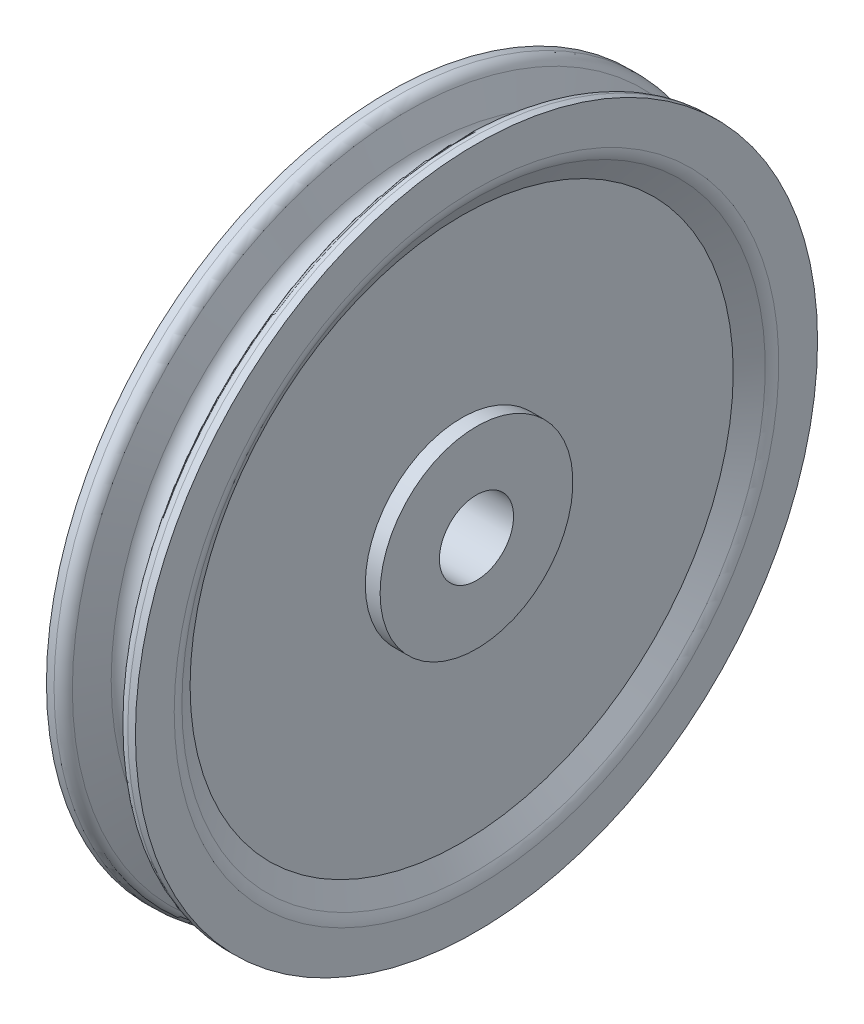
ISO-10303-21;
HEADER;
FILE_DESCRIPTION(('STEP AP214'),'2;1');
FILE_NAME('part.step','',(''),(''),'','','');
FILE_SCHEMA(('AUTOMOTIVE_DESIGN { 1 0 10303 214 1 1 1 1 }'));
ENDSEC;
DATA;
#1=APPLICATION_CONTEXT('core data for automotive mechanical design processes');
#2=APPLICATION_PROTOCOL_DEFINITION('international standard','automotive_design',2000,#1);
#3=PRODUCT_CONTEXT('',#1,'mechanical');
#4=PRODUCT('Part','Part','',(#3));
#5=PRODUCT_RELATED_PRODUCT_CATEGORY('part','',(#4));
#6=PRODUCT_DEFINITION_FORMATION('','',#4);
#7=PRODUCT_DEFINITION_CONTEXT('part definition',#1,'design');
#8=PRODUCT_DEFINITION('design','',#6,#7);
#9=PRODUCT_DEFINITION_SHAPE('','',#8);
#10=(LENGTH_UNIT() NAMED_UNIT(*) SI_UNIT(.MILLI.,.METRE.));
#11=(NAMED_UNIT(*) PLANE_ANGLE_UNIT() SI_UNIT($,.RADIAN.));
#12=(NAMED_UNIT(*) SI_UNIT($,.STERADIAN.) SOLID_ANGLE_UNIT());
#13=UNCERTAINTY_MEASURE_WITH_UNIT(LENGTH_MEASURE(1.E-05),#10,'distance_accuracy_value','');
#14=(GEOMETRIC_REPRESENTATION_CONTEXT(3) GLOBAL_UNCERTAINTY_ASSIGNED_CONTEXT((#13)) GLOBAL_UNIT_ASSIGNED_CONTEXT((#10,
#11,#12)) REPRESENTATION_CONTEXT('',''));
#15=CARTESIAN_POINT('',(0.,0.,0.));
#16=DIRECTION('',(0.,0.,1.));
#17=DIRECTION('',(1.,0.,0.));
#18=AXIS2_PLACEMENT_3D('',#15,#16,#17);
#19=CARTESIAN_POINT('',(8.,0.,0.));
#20=DIRECTION('',(-1.,0.,0.));
#21=DIRECTION('',(0.,0.,1.));
#22=AXIS2_PLACEMENT_3D('',#19,#20,#21);
#23=TOROIDAL_SURFACE('',#22,101.919552915921,7.);
#24=CARTESIAN_POINT('',(14.0208621513478,0.,0.));
#25=DIRECTION('',(-1.,0.,0.));
#26=DIRECTION('',(0.,0.,1.));
#27=AXIS2_PLACEMENT_3D('',#24,#25,#26);
#28=CIRCLE('',#27,98.3489480715747);
#29=CARTESIAN_POINT('',(14.0208621513478,0.,98.3489480715747));
#30=VERTEX_POINT('',#29);
#31=EDGE_CURVE('E96',#30,#30,#28,.T.);
#32=ORIENTED_EDGE('',*,*,#31,.T.);
#33=EDGE_LOOP('',(#32));
#34=FACE_BOUND('',#33,.T.);
#35=CARTESIAN_POINT('',(15.,0.,0.));
#36=DIRECTION('',(-1.,0.,0.));
#37=DIRECTION('',(0.,0.,1.));
#38=AXIS2_PLACEMENT_3D('',#35,#36,#37);
#39=CIRCLE('',#38,101.919552915921);
#40=CARTESIAN_POINT('',(15.,0.,101.919552915921));
#41=VERTEX_POINT('',#40);
#42=EDGE_CURVE('E10',#41,#41,#39,.T.);
#43=ORIENTED_EDGE('',*,*,#42,.F.);
#44=EDGE_LOOP('',(#43));
#45=FACE_BOUND('',#44,.T.);
#46=ADVANCED_FACE('F32',(#34,#45),#23,.T.);
#47=CARTESIAN_POINT('',(15.,0.,0.));
#48=DIRECTION('',(1.,0.,0.));
#49=DIRECTION('',(0.,0.,-1.));
#50=AXIS2_PLACEMENT_3D('',#47,#48,#49);
#51=PLANE('',#50);
#52=ORIENTED_EDGE('',*,*,#42,.T.);
#53=EDGE_LOOP('',(#52));
#54=FACE_BOUND('',#53,.T.);
#55=CARTESIAN_POINT('',(15.,0.,0.));
#56=DIRECTION('',(-1.,0.,0.));
#57=DIRECTION('',(0.,0.,1.));
#58=AXIS2_PLACEMENT_3D('',#55,#56,#57);
#59=CIRCLE('',#58,115.);
#60=CARTESIAN_POINT('',(15.,0.,115.));
#61=VERTEX_POINT('',#60);
#62=EDGE_CURVE('E38',#61,#61,#59,.T.);
#63=ORIENTED_EDGE('',*,*,#62,.F.);
#64=EDGE_LOOP('',(#63));
#65=FACE_BOUND('',#64,.T.);
#66=ADVANCED_FACE('F265',(#54,#65),#51,.T.);
#67=CARTESIAN_POINT('',(-36.211666464151,0.,0.));
#68=DIRECTION('',(-1.,0.,0.));
#69=DIRECTION('',(0.,0.,1.));
#70=AXIS2_PLACEMENT_3D('',#67,#68,#69);
#71=CYLINDRICAL_SURFACE('',#70,115.);
#72=ORIENTED_EDGE('',*,*,#62,.T.);
#73=EDGE_LOOP('',(#72));
#74=FACE_BOUND('',#73,.T.);
#75=CARTESIAN_POINT('',(12.4272647682459,0.,0.));
#76=DIRECTION('',(-1.,0.,0.));
#77=DIRECTION('',(0.,0.,1.));
#78=AXIS2_PLACEMENT_3D('',#75,#76,#77);
#79=CIRCLE('',#78,115.);
#80=CARTESIAN_POINT('',(12.4272647682459,0.,115.));
#81=VERTEX_POINT('',#80);
#82=EDGE_CURVE('E42',#81,#81,#79,.T.);
#83=ORIENTED_EDGE('',*,*,#82,.F.);
#84=EDGE_LOOP('',(#83));
#85=FACE_BOUND('',#84,.T.);
#86=ADVANCED_FACE('F262',(#74,#85),#71,.T.);
#87=CARTESIAN_POINT('',(12.4272647682459,0.,0.));
#88=DIRECTION('',(-1.,0.,0.));
#89=DIRECTION('',(0.,0.,1.));
#90=AXIS2_PLACEMENT_3D('',#87,#88,#89);
#91=TOROIDAL_SURFACE('',#90,111.,4.);
#92=CARTESIAN_POINT('',(8.73174663820076,0.,0.));
#93=DIRECTION('',(-1.,0.,0.));
#94=DIRECTION('',(0.,0.,1.));
#95=AXIS2_PLACEMENT_3D('',#92,#93,#94);
#96=CIRCLE('',#95,112.53073372946);
#97=CARTESIAN_POINT('',(8.73174663820076,0.,112.53073372946));
#98=VERTEX_POINT('',#97);
#99=EDGE_CURVE('E46',#98,#98,#96,.T.);
#100=ORIENTED_EDGE('',*,*,#99,.F.);
#101=EDGE_LOOP('',(#100));
#102=FACE_BOUND('',#101,.T.);
#103=ORIENTED_EDGE('',*,*,#82,.T.);
#104=EDGE_LOOP('',(#103));
#105=FACE_BOUND('',#104,.T.);
#106=ADVANCED_FACE('F258',(#102,#105),#91,.T.);
#107=CARTESIAN_POINT('',(4.89656152230981,0.,0.));
#108=DIRECTION('',(1.,0.,0.));
#109=DIRECTION('',(0.,0.,-1.));
#110=AXIS2_PLACEMENT_3D('',#107,#108,#109);
#111=CONICAL_SURFACE('',#110,103.271777808465,1.17809724509617);
#112=ORIENTED_EDGE('',*,*,#99,.T.);
#113=EDGE_LOOP('',(#112));
#114=FACE_BOUND('',#113,.T.);
#115=CARTESIAN_POINT('',(4.89656152230981,0.,0.));
#116=DIRECTION('',(-1.,0.,0.));
#117=DIRECTION('',(0.,0.,1.));
#118=AXIS2_PLACEMENT_3D('',#115,#116,#117);
#119=CIRCLE('',#118,103.271777808465);
#120=CARTESIAN_POINT('',(4.89656152230981,0.,103.271777808465));
#121=VERTEX_POINT('',#120);
#122=EDGE_CURVE('E51',#121,#121,#119,.T.);
#123=ORIENTED_EDGE('',*,*,#122,.F.);
#124=EDGE_LOOP('',(#123));
#125=FACE_BOUND('',#124,.T.);
#126=ADVANCED_FACE('F254',(#114,#125),#111,.T.);
#127=CARTESIAN_POINT('',(0.,0.,0.));
#128=DIRECTION('',(-1.,0.,0.));
#129=DIRECTION('',(0.,0.,1.));
#130=AXIS2_PLACEMENT_3D('',#127,#128,#129);
#131=TOROIDAL_SURFACE('',#130,105.3,5.29999999999999);
#132=ORIENTED_EDGE('',*,*,#122,.T.);
#133=EDGE_LOOP('',(#132));
#134=FACE_BOUND('',#133,.T.);
#135=CARTESIAN_POINT('',(-4.89656152230981,0.,0.));
#136=DIRECTION('',(-1.,0.,0.));
#137=DIRECTION('',(0.,0.,1.));
#138=AXIS2_PLACEMENT_3D('',#135,#136,#137);
#139=CIRCLE('',#138,103.271777808465);
#140=CARTESIAN_POINT('',(-4.89656152230981,0.,103.271777808465));
#141=VERTEX_POINT('',#140);
#142=EDGE_CURVE('E54',#141,#141,#139,.T.);
#143=ORIENTED_EDGE('',*,*,#142,.F.);
#144=EDGE_LOOP('',(#143));
#145=FACE_BOUND('',#144,.T.);
#146=ADVANCED_FACE('F250',(#134,#145),#131,.F.);
#147=CARTESIAN_POINT('',(-4.89656152230981,0.,0.));
#148=DIRECTION('',(-1.,0.,0.));
#149=DIRECTION('',(0.,0.,1.));
#150=AXIS2_PLACEMENT_3D('',#147,#148,#149);
#151=CONICAL_SURFACE('',#150,103.271777808465,1.17809724509617);
#152=CARTESIAN_POINT('',(-8.73174663820077,0.,0.));
#153=DIRECTION('',(-1.,0.,0.));
#154=DIRECTION('',(0.,0.,1.));
#155=AXIS2_PLACEMENT_3D('',#152,#153,#154);
#156=CIRCLE('',#155,112.53073372946);
#157=CARTESIAN_POINT('',(-8.73174663820077,0.,112.53073372946));
#158=VERTEX_POINT('',#157);
#159=EDGE_CURVE('E57',#158,#158,#156,.T.);
#160=ORIENTED_EDGE('',*,*,#159,.F.);
#161=EDGE_LOOP('',(#160));
#162=FACE_BOUND('',#161,.T.);
#163=ORIENTED_EDGE('',*,*,#142,.T.);
#164=EDGE_LOOP('',(#163));
#165=FACE_BOUND('',#164,.T.);
#166=ADVANCED_FACE('F246',(#162,#165),#151,.T.);
#167=CARTESIAN_POINT('',(-12.4272647682459,0.,0.));
#168=DIRECTION('',(-1.,0.,0.));
#169=DIRECTION('',(0.,0.,1.));
#170=AXIS2_PLACEMENT_3D('',#167,#168,#169);
#171=TOROIDAL_SURFACE('',#170,111.,4.);
#172=CARTESIAN_POINT('',(-12.4272647682459,0.,0.));
#173=DIRECTION('',(-1.,0.,0.));
#174=DIRECTION('',(0.,0.,1.));
#175=AXIS2_PLACEMENT_3D('',#172,#173,#174);
#176=CIRCLE('',#175,115.);
#177=CARTESIAN_POINT('',(-12.4272647682459,0.,115.));
#178=VERTEX_POINT('',#177);
#179=EDGE_CURVE('E60',#178,#178,#176,.T.);
#180=ORIENTED_EDGE('',*,*,#179,.F.);
#181=EDGE_LOOP('',(#180));
#182=FACE_BOUND('',#181,.T.);
#183=ORIENTED_EDGE('',*,*,#159,.T.);
#184=EDGE_LOOP('',(#183));
#185=FACE_BOUND('',#184,.T.);
#186=ADVANCED_FACE('F242',(#182,#185),#171,.T.);
#187=CARTESIAN_POINT('',(-36.211666464151,0.,0.));
#188=DIRECTION('',(-1.,0.,0.));
#189=DIRECTION('',(0.,0.,1.));
#190=AXIS2_PLACEMENT_3D('',#187,#188,#189);
#191=CYLINDRICAL_SURFACE('',#190,115.);
#192=ORIENTED_EDGE('',*,*,#179,.T.);
#193=EDGE_LOOP('',(#192));
#194=FACE_BOUND('',#193,.T.);
#195=CARTESIAN_POINT('',(-15.,0.,0.));
#196=DIRECTION('',(-1.,0.,0.));
#197=DIRECTION('',(0.,0.,1.));
#198=AXIS2_PLACEMENT_3D('',#195,#196,#197);
#199=CIRCLE('',#198,115.);
#200=CARTESIAN_POINT('',(-15.,0.,115.));
#201=VERTEX_POINT('',#200);
#202=EDGE_CURVE('E63',#201,#201,#199,.T.);
#203=ORIENTED_EDGE('',*,*,#202,.F.);
#204=EDGE_LOOP('',(#203));
#205=FACE_BOUND('',#204,.T.);
#206=ADVANCED_FACE('F238',(#194,#205),#191,.T.);
#207=CARTESIAN_POINT('',(-15.,0.,0.));
#208=DIRECTION('',(1.,0.,0.));
#209=DIRECTION('',(0.,0.,-1.));
#210=AXIS2_PLACEMENT_3D('',#207,#208,#209);
#211=PLANE('',#210);
#212=CARTESIAN_POINT('',(-15.,0.,0.));
#213=DIRECTION('',(-1.,0.,0.));
#214=DIRECTION('',(0.,0.,1.));
#215=AXIS2_PLACEMENT_3D('',#212,#213,#214);
#216=CIRCLE('',#215,101.919552915921);
#217=CARTESIAN_POINT('',(-15.,0.,101.919552915921));
#218=VERTEX_POINT('',#217);
#219=EDGE_CURVE('E66',#218,#218,#216,.T.);
#220=ORIENTED_EDGE('',*,*,#219,.F.);
#221=EDGE_LOOP('',(#220));
#222=FACE_BOUND('',#221,.T.);
#223=ORIENTED_EDGE('',*,*,#202,.T.);
#224=EDGE_LOOP('',(#223));
#225=FACE_BOUND('',#224,.T.);
#226=ADVANCED_FACE('F234',(#222,#225),#211,.F.);
#227=CARTESIAN_POINT('',(-7.99999999999999,0.,0.));
#228=DIRECTION('',(-1.,0.,0.));
#229=DIRECTION('',(0.,0.,1.));
#230=AXIS2_PLACEMENT_3D('',#227,#228,#229);
#231=TOROIDAL_SURFACE('',#230,101.919552915921,7.);
#232=CARTESIAN_POINT('',(-14.0208621513478,0.,0.));
#233=DIRECTION('',(-1.,0.,0.));
#234=DIRECTION('',(0.,0.,1.));
#235=AXIS2_PLACEMENT_3D('',#232,#233,#234);
#236=CIRCLE('',#235,98.3489480715747);
#237=CARTESIAN_POINT('',(-14.0208621513478,0.,98.3489480715747));
#238=VERTEX_POINT('',#237);
#239=EDGE_CURVE('E69',#238,#238,#236,.T.);
#240=ORIENTED_EDGE('',*,*,#239,.F.);
#241=EDGE_LOOP('',(#240));
#242=FACE_BOUND('',#241,.T.);
#243=ORIENTED_EDGE('',*,*,#219,.T.);
#244=EDGE_LOOP('',(#243));
#245=FACE_BOUND('',#244,.T.);
#246=ADVANCED_FACE('F230',(#242,#245),#231,.T.);
#247=CARTESIAN_POINT('',(-14.0208621513478,0.,0.));
#248=DIRECTION('',(-1.,0.,0.));
#249=DIRECTION('',(0.,0.,1.));
#250=AXIS2_PLACEMENT_3D('',#247,#248,#249);
#251=CONICAL_SURFACE('',#250,98.3489480715747,1.03551108141569);
#252=CARTESIAN_POINT('',(-9.99999999999999,0.,0.));
#253=DIRECTION('',(-1.,0.,0.));
#254=DIRECTION('',(0.,0.,1.));
#255=AXIS2_PLACEMENT_3D('',#252,#253,#254);
#256=CIRCLE('',#255,91.5688483970978);
#257=CARTESIAN_POINT('',(-9.99999999999999,0.,91.5688483970978));
#258=VERTEX_POINT('',#257);
#259=EDGE_CURVE('E72',#258,#258,#256,.T.);
#260=ORIENTED_EDGE('',*,*,#259,.F.);
#261=EDGE_LOOP('',(#260));
#262=FACE_BOUND('',#261,.T.);
#263=ORIENTED_EDGE('',*,*,#239,.T.);
#264=EDGE_LOOP('',(#263));
#265=FACE_BOUND('',#264,.T.);
#266=ADVANCED_FACE('F226',(#262,#265),#251,.F.);
#267=CARTESIAN_POINT('',(-9.99999999999999,0.,0.));
#268=DIRECTION('',(1.,0.,0.));
#269=DIRECTION('',(0.,0.,-1.));
#270=AXIS2_PLACEMENT_3D('',#267,#268,#269);
#271=PLANE('',#270);
#272=CARTESIAN_POINT('',(-9.99999999999999,0.,0.));
#273=DIRECTION('',(-1.,0.,0.));
#274=DIRECTION('',(0.,0.,1.));
#275=AXIS2_PLACEMENT_3D('',#272,#273,#274);
#276=CIRCLE('',#275,32.5);
#277=CARTESIAN_POINT('',(-9.99999999999999,0.,32.5));
#278=VERTEX_POINT('',#277);
#279=EDGE_CURVE('E75',#278,#278,#276,.T.);
#280=ORIENTED_EDGE('',*,*,#279,.F.);
#281=EDGE_LOOP('',(#280));
#282=FACE_BOUND('',#281,.T.);
#283=ORIENTED_EDGE('',*,*,#259,.T.);
#284=EDGE_LOOP('',(#283));
#285=FACE_BOUND('',#284,.T.);
#286=ADVANCED_FACE('F222',(#282,#285),#271,.F.);
#287=CARTESIAN_POINT('',(-36.211666464151,0.,0.));
#288=DIRECTION('',(-1.,0.,0.));
#289=DIRECTION('',(0.,0.,1.));
#290=AXIS2_PLACEMENT_3D('',#287,#288,#289);
#291=CYLINDRICAL_SURFACE('',#290,32.5);
#292=ORIENTED_EDGE('',*,*,#279,.T.);
#293=EDGE_LOOP('',(#292));
#294=FACE_BOUND('',#293,.T.);
#295=CARTESIAN_POINT('',(-15.,0.,0.));
#296=DIRECTION('',(-1.,0.,0.));
#297=DIRECTION('',(0.,0.,1.));
#298=AXIS2_PLACEMENT_3D('',#295,#296,#297);
#299=CIRCLE('',#298,32.5);
#300=CARTESIAN_POINT('',(-15.,0.,32.5));
#301=VERTEX_POINT('',#300);
#302=EDGE_CURVE('E78',#301,#301,#299,.T.);
#303=ORIENTED_EDGE('',*,*,#302,.F.);
#304=EDGE_LOOP('',(#303));
#305=FACE_BOUND('',#304,.T.);
#306=ADVANCED_FACE('F218',(#294,#305),#291,.T.);
#307=CARTESIAN_POINT('',(-15.,0.,0.));
#308=DIRECTION('',(1.,0.,0.));
#309=DIRECTION('',(0.,0.,-1.));
#310=AXIS2_PLACEMENT_3D('',#307,#308,#309);
#311=PLANE('',#310);
#312=CARTESIAN_POINT('',(-15.,0.,0.));
#313=DIRECTION('',(-1.,0.,0.));
#314=DIRECTION('',(0.,0.,1.));
#315=AXIS2_PLACEMENT_3D('',#312,#313,#314);
#316=CIRCLE('',#315,12.5);
#317=CARTESIAN_POINT('',(-15.,0.,12.5));
#318=VERTEX_POINT('',#317);
#319=EDGE_CURVE('E81',#318,#318,#316,.T.);
#320=ORIENTED_EDGE('',*,*,#319,.F.);
#321=EDGE_LOOP('',(#320));
#322=FACE_BOUND('',#321,.T.);
#323=ORIENTED_EDGE('',*,*,#302,.T.);
#324=EDGE_LOOP('',(#323));
#325=FACE_BOUND('',#324,.T.);
#326=ADVANCED_FACE('F214',(#322,#325),#311,.F.);
#327=CARTESIAN_POINT('',(-36.211666464151,0.,0.));
#328=DIRECTION('',(-1.,0.,0.));
#329=DIRECTION('',(0.,0.,1.));
#330=AXIS2_PLACEMENT_3D('',#327,#328,#329);
#331=CYLINDRICAL_SURFACE('',#330,12.5);
#332=CARTESIAN_POINT('',(15.,0.,0.));
#333=DIRECTION('',(-1.,0.,0.));
#334=DIRECTION('',(0.,0.,1.));
#335=AXIS2_PLACEMENT_3D('',#332,#333,#334);
#336=CIRCLE('',#335,12.5);
#337=CARTESIAN_POINT('',(15.,0.,12.5));
#338=VERTEX_POINT('',#337);
#339=EDGE_CURVE('E84',#338,#338,#336,.T.);
#340=ORIENTED_EDGE('',*,*,#339,.F.);
#341=EDGE_LOOP('',(#340));
#342=FACE_BOUND('',#341,.T.);
#343=ORIENTED_EDGE('',*,*,#319,.T.);
#344=EDGE_LOOP('',(#343));
#345=FACE_BOUND('',#344,.T.);
#346=ADVANCED_FACE('F210',(#342,#345),#331,.F.);
#347=CARTESIAN_POINT('',(15.,0.,0.));
#348=DIRECTION('',(1.,0.,0.));
#349=DIRECTION('',(0.,0.,-1.));
#350=AXIS2_PLACEMENT_3D('',#347,#348,#349);
#351=PLANE('',#350);
#352=ORIENTED_EDGE('',*,*,#339,.T.);
#353=EDGE_LOOP('',(#352));
#354=FACE_BOUND('',#353,.T.);
#355=CARTESIAN_POINT('',(15.,0.,0.));
#356=DIRECTION('',(-1.,0.,0.));
#357=DIRECTION('',(0.,0.,1.));
#358=AXIS2_PLACEMENT_3D('',#355,#356,#357);
#359=CIRCLE('',#358,32.5);
#360=CARTESIAN_POINT('',(15.,0.,32.5));
#361=VERTEX_POINT('',#360);
#362=EDGE_CURVE('E87',#361,#361,#359,.T.);
#363=ORIENTED_EDGE('',*,*,#362,.F.);
#364=EDGE_LOOP('',(#363));
#365=FACE_BOUND('',#364,.T.);
#366=ADVANCED_FACE('F206',(#354,#365),#351,.T.);
#367=CARTESIAN_POINT('',(-36.211666464151,0.,0.));
#368=DIRECTION('',(-1.,0.,0.));
#369=DIRECTION('',(0.,0.,1.));
#370=AXIS2_PLACEMENT_3D('',#367,#368,#369);
#371=CYLINDRICAL_SURFACE('',#370,32.5);
#372=ORIENTED_EDGE('',*,*,#362,.T.);
#373=EDGE_LOOP('',(#372));
#374=FACE_BOUND('',#373,.T.);
#375=CARTESIAN_POINT('',(10.,0.,0.));
#376=DIRECTION('',(-1.,0.,0.));
#377=DIRECTION('',(0.,0.,1.));
#378=AXIS2_PLACEMENT_3D('',#375,#376,#377);
#379=CIRCLE('',#378,32.5);
#380=CARTESIAN_POINT('',(10.,0.,32.5));
#381=VERTEX_POINT('',#380);
#382=EDGE_CURVE('E90',#381,#381,#379,.T.);
#383=ORIENTED_EDGE('',*,*,#382,.F.);
#384=EDGE_LOOP('',(#383));
#385=FACE_BOUND('',#384,.T.);
#386=ADVANCED_FACE('F202',(#374,#385),#371,.T.);
#387=CARTESIAN_POINT('',(10.,0.,0.));
#388=DIRECTION('',(1.,0.,0.));
#389=DIRECTION('',(0.,0.,-1.));
#390=AXIS2_PLACEMENT_3D('',#387,#388,#389);
#391=PLANE('',#390);
#392=ORIENTED_EDGE('',*,*,#382,.T.);
#393=EDGE_LOOP('',(#392));
#394=FACE_BOUND('',#393,.T.);
#395=CARTESIAN_POINT('',(9.99999999999999,0.,0.));
#396=DIRECTION('',(-1.,0.,0.));
#397=DIRECTION('',(0.,0.,1.));
#398=AXIS2_PLACEMENT_3D('',#395,#396,#397);
#399=CIRCLE('',#398,91.5688483970978);
#400=CARTESIAN_POINT('',(9.99999999999999,0.,91.5688483970978));
#401=VERTEX_POINT('',#400);
#402=EDGE_CURVE('E93',#401,#401,#399,.T.);
#403=ORIENTED_EDGE('',*,*,#402,.F.);
#404=EDGE_LOOP('',(#403));
#405=FACE_BOUND('',#404,.T.);
#406=ADVANCED_FACE('F198',(#394,#405),#391,.T.);
#407=CARTESIAN_POINT('',(14.0208621513478,0.,0.));
#408=DIRECTION('',(1.,0.,0.));
#409=DIRECTION('',(0.,0.,-1.));
#410=AXIS2_PLACEMENT_3D('',#407,#408,#409);
#411=CONICAL_SURFACE('',#410,98.3489480715747,1.03551108141569);
#412=ORIENTED_EDGE('',*,*,#402,.T.);
#413=EDGE_LOOP('',(#412));
#414=FACE_BOUND('',#413,.T.);
#415=ORIENTED_EDGE('',*,*,#31,.F.);
#416=EDGE_LOOP('',(#415));
#417=FACE_BOUND('',#416,.T.);
#418=ADVANCED_FACE('F195',(#414,#417),#411,.F.);
#419=CLOSED_SHELL('',(#46,#66,#86,#106,#126,#146,#166,#186,#206,#226,#246,#266,#286,#306,#326,
#346,#366,#386,#406,#418));
#420=CARTESIAN_POINT('',(8.,0.,0.));
#421=DIRECTION('',(-1.,0.,0.));
#422=DIRECTION('',(0.,0.,1.));
#423=AXIS2_PLACEMENT_3D('',#420,#421,#422);
#424=TOROIDAL_SURFACE('',#423,101.919552915921,6.9);
#425=CARTESIAN_POINT('',(13.9348498349,0.,0.));
#426=DIRECTION('',(-1.,0.,0.));
#427=DIRECTION('',(0.,0.,1.));
#428=AXIS2_PLACEMENT_3D('',#425,#426,#427);
#429=CIRCLE('',#428,98.3999567122082);
#430=CARTESIAN_POINT('',(13.9348498349,0.,98.3999567122082));
#431=VERTEX_POINT('',#430);
#432=EDGE_CURVE('E156',#431,#431,#429,.T.);
#433=ORIENTED_EDGE('',*,*,#432,.F.);
#434=EDGE_LOOP('',(#433));
#435=FACE_BOUND('',#434,.T.);
#436=CARTESIAN_POINT('',(14.9,0.,0.));
#437=DIRECTION('',(-1.,0.,0.));
#438=DIRECTION('',(0.,0.,1.));
#439=AXIS2_PLACEMENT_3D('',#436,#437,#438);
#440=CIRCLE('',#439,101.919552915921);
#441=CARTESIAN_POINT('',(14.9,0.,101.919552915921));
#442=VERTEX_POINT('',#441);
#443=EDGE_CURVE('E99',#442,#442,#440,.T.);
#444=ORIENTED_EDGE('',*,*,#443,.T.);
#445=EDGE_LOOP('',(#444));
#446=FACE_BOUND('',#445,.T.);
#447=ADVANCED_FACE('F162',(#435,#446),#424,.F.);
#448=CARTESIAN_POINT('',(14.9,0.,0.));
#449=DIRECTION('',(1.,0.,0.));
#450=DIRECTION('',(0.,0.,-1.));
#451=AXIS2_PLACEMENT_3D('',#448,#449,#450);
#452=PLANE('',#451);
#453=ORIENTED_EDGE('',*,*,#443,.F.);
#454=EDGE_LOOP('',(#453));
#455=FACE_BOUND('',#454,.T.);
#456=CARTESIAN_POINT('',(14.9,0.,0.));
#457=DIRECTION('',(-1.,0.,0.));
#458=DIRECTION('',(0.,0.,1.));
#459=AXIS2_PLACEMENT_3D('',#456,#457,#458);
#460=CIRCLE('',#459,114.9);
#461=CARTESIAN_POINT('',(14.9,0.,114.9));
#462=VERTEX_POINT('',#461);
#463=EDGE_CURVE('E102',#462,#462,#460,.T.);
#464=ORIENTED_EDGE('',*,*,#463,.T.);
#465=EDGE_LOOP('',(#464));
#466=FACE_BOUND('',#465,.T.);
#467=ADVANCED_FACE('F165',(#455,#466),#452,.F.);
#468=CARTESIAN_POINT('',(-36.211666464151,0.,0.));
#469=DIRECTION('',(-1.,0.,0.));
#470=DIRECTION('',(0.,0.,1.));
#471=AXIS2_PLACEMENT_3D('',#468,#469,#470);
#472=CYLINDRICAL_SURFACE('',#471,114.9);
#473=ORIENTED_EDGE('',*,*,#463,.F.);
#474=EDGE_LOOP('',(#473));
#475=FACE_BOUND('',#474,.T.);
#476=CARTESIAN_POINT('',(12.4272647682459,0.,0.));
#477=DIRECTION('',(-1.,0.,0.));
#478=DIRECTION('',(0.,0.,1.));
#479=AXIS2_PLACEMENT_3D('',#476,#477,#478);
#480=CIRCLE('',#479,114.9);
#481=CARTESIAN_POINT('',(12.4272647682459,0.,114.9));
#482=VERTEX_POINT('',#481);
#483=EDGE_CURVE('E105',#482,#482,#480,.T.);
#484=ORIENTED_EDGE('',*,*,#483,.T.);
#485=EDGE_LOOP('',(#484));
#486=FACE_BOUND('',#485,.T.);
#487=ADVANCED_FACE('F172',(#475,#486),#472,.F.);
#488=CARTESIAN_POINT('',(12.4272647682459,0.,0.));
#489=DIRECTION('',(-1.,0.,0.));
#490=DIRECTION('',(0.,0.,1.));
#491=AXIS2_PLACEMENT_3D('',#488,#489,#490);
#492=TOROIDAL_SURFACE('',#491,111.,3.9);
#493=CARTESIAN_POINT('',(8.82413459145189,0.,0.));
#494=DIRECTION('',(-1.,0.,0.));
#495=DIRECTION('',(0.,0.,1.));
#496=AXIS2_PLACEMENT_3D('',#493,#494,#495);
#497=CIRCLE('',#496,112.492465386224);
#498=CARTESIAN_POINT('',(8.82413459145189,0.,112.492465386224));
#499=VERTEX_POINT('',#498);
#500=EDGE_CURVE('E108',#499,#499,#497,.T.);
#501=ORIENTED_EDGE('',*,*,#500,.T.);
#502=EDGE_LOOP('',(#501));
#503=FACE_BOUND('',#502,.T.);
#504=ORIENTED_EDGE('',*,*,#483,.F.);
#505=EDGE_LOOP('',(#504));
#506=FACE_BOUND('',#505,.T.);
#507=ADVANCED_FACE('F178',(#503,#506),#492,.F.);
#508=CARTESIAN_POINT('',(4.98894947556094,0.,0.));
#509=DIRECTION('',(1.,0.,0.));
#510=DIRECTION('',(0.,0.,-1.));
#511=AXIS2_PLACEMENT_3D('',#508,#509,#510);
#512=CONICAL_SURFACE('',#511,103.233509465229,1.17809724509617);
#513=ORIENTED_EDGE('',*,*,#500,.F.);
#514=EDGE_LOOP('',(#513));
#515=FACE_BOUND('',#514,.T.);
#516=CARTESIAN_POINT('',(4.98894947556094,0.,0.));
#517=DIRECTION('',(-1.,0.,0.));
#518=DIRECTION('',(0.,0.,1.));
#519=AXIS2_PLACEMENT_3D('',#516,#517,#518);
#520=CIRCLE('',#519,103.233509465229);
#521=CARTESIAN_POINT('',(4.98894947556094,0.,103.233509465229));
#522=VERTEX_POINT('',#521);
#523=EDGE_CURVE('E111',#522,#522,#520,.T.);
#524=ORIENTED_EDGE('',*,*,#523,.T.);
#525=EDGE_LOOP('',(#524));
#526=FACE_BOUND('',#525,.T.);
#527=ADVANCED_FACE('F183',(#515,#526),#512,.F.);
#528=CARTESIAN_POINT('',(0.,0.,0.));
#529=DIRECTION('',(-1.,0.,0.));
#530=DIRECTION('',(0.,0.,1.));
#531=AXIS2_PLACEMENT_3D('',#528,#529,#530);
#532=TOROIDAL_SURFACE('',#531,105.3,5.4);
#533=ORIENTED_EDGE('',*,*,#523,.F.);
#534=EDGE_LOOP('',(#533));
#535=FACE_BOUND('',#534,.T.);
#536=CARTESIAN_POINT('',(-4.98894947556095,0.,0.));
#537=DIRECTION('',(-1.,0.,0.));
#538=DIRECTION('',(0.,0.,1.));
#539=AXIS2_PLACEMENT_3D('',#536,#537,#538);
#540=CIRCLE('',#539,103.233509465229);
#541=CARTESIAN_POINT('',(-4.98894947556095,0.,103.233509465229));
#542=VERTEX_POINT('',#541);
#543=EDGE_CURVE('E114',#542,#542,#540,.T.);
#544=ORIENTED_EDGE('',*,*,#543,.T.);
#545=EDGE_LOOP('',(#544));
#546=FACE_BOUND('',#545,.T.);
#547=ADVANCED_FACE('F189',(#535,#546),#532,.T.);
#548=CARTESIAN_POINT('',(-4.98894947556095,0.,0.));
#549=DIRECTION('',(-1.,0.,0.));
#550=DIRECTION('',(0.,0.,1.));
#551=AXIS2_PLACEMENT_3D('',#548,#549,#550);
#552=CONICAL_SURFACE('',#551,103.233509465229,1.17809724509617);
#553=CARTESIAN_POINT('',(-8.82413459145191,0.,0.));
#554=DIRECTION('',(-1.,0.,0.));
#555=DIRECTION('',(0.,0.,1.));
#556=AXIS2_PLACEMENT_3D('',#553,#554,#555);
#557=CIRCLE('',#556,112.492465386224);
#558=CARTESIAN_POINT('',(-8.82413459145191,0.,112.492465386224));
#559=VERTEX_POINT('',#558);
#560=EDGE_CURVE('E117',#559,#559,#557,.T.);
#561=ORIENTED_EDGE('',*,*,#560,.T.);
#562=EDGE_LOOP('',(#561));
#563=FACE_BOUND('',#562,.T.);
#564=ORIENTED_EDGE('',*,*,#543,.F.);
#565=EDGE_LOOP('',(#564));
#566=FACE_BOUND('',#565,.T.);
#567=ADVANCED_FACE('F426',(#563,#566),#552,.F.);
#568=CARTESIAN_POINT('',(-12.4272647682459,0.,0.));
#569=DIRECTION('',(-1.,0.,0.));
#570=DIRECTION('',(0.,0.,1.));
#571=AXIS2_PLACEMENT_3D('',#568,#569,#570);
#572=TOROIDAL_SURFACE('',#571,111.,3.9);
#573=CARTESIAN_POINT('',(-12.4272647682459,0.,0.));
#574=DIRECTION('',(-1.,0.,0.));
#575=DIRECTION('',(0.,0.,1.));
#576=AXIS2_PLACEMENT_3D('',#573,#574,#575);
#577=CIRCLE('',#576,114.9);
#578=CARTESIAN_POINT('',(-12.4272647682459,0.,114.9));
#579=VERTEX_POINT('',#578);
#580=EDGE_CURVE('E120',#579,#579,#577,.T.);
#581=ORIENTED_EDGE('',*,*,#580,.T.);
#582=EDGE_LOOP('',(#581));
#583=FACE_BOUND('',#582,.T.);
#584=ORIENTED_EDGE('',*,*,#560,.F.);
#585=EDGE_LOOP('',(#584));
#586=FACE_BOUND('',#585,.T.);
#587=ADVANCED_FACE('F435',(#583,#586),#572,.F.);
#588=CARTESIAN_POINT('',(-36.211666464151,0.,0.));
#589=DIRECTION('',(-1.,0.,0.));
#590=DIRECTION('',(0.,0.,1.));
#591=AXIS2_PLACEMENT_3D('',#588,#589,#590);
#592=CYLINDRICAL_SURFACE('',#591,114.9);
#593=ORIENTED_EDGE('',*,*,#580,.F.);
#594=EDGE_LOOP('',(#593));
#595=FACE_BOUND('',#594,.T.);
#596=CARTESIAN_POINT('',(-14.9,0.,0.));
#597=DIRECTION('',(-1.,0.,0.));
#598=DIRECTION('',(0.,0.,1.));
#599=AXIS2_PLACEMENT_3D('',#596,#597,#598);
#600=CIRCLE('',#599,114.9);
#601=CARTESIAN_POINT('',(-14.9,0.,114.9));
#602=VERTEX_POINT('',#601);
#603=EDGE_CURVE('E123',#602,#602,#600,.T.);
#604=ORIENTED_EDGE('',*,*,#603,.T.);
#605=EDGE_LOOP('',(#604));
#606=FACE_BOUND('',#605,.T.);
#607=ADVANCED_FACE('F445',(#595,#606),#592,.F.);
#608=CARTESIAN_POINT('',(-14.9,0.,0.));
#609=DIRECTION('',(1.,0.,0.));
#610=DIRECTION('',(0.,0.,-1.));
#611=AXIS2_PLACEMENT_3D('',#608,#609,#610);
#612=PLANE('',#611);
#613=CARTESIAN_POINT('',(-14.9,0.,0.));
#614=DIRECTION('',(-1.,0.,0.));
#615=DIRECTION('',(0.,0.,1.));
#616=AXIS2_PLACEMENT_3D('',#613,#614,#615);
#617=CIRCLE('',#616,101.919552915921);
#618=CARTESIAN_POINT('',(-14.9,0.,101.919552915921));
#619=VERTEX_POINT('',#618);
#620=EDGE_CURVE('E126',#619,#619,#617,.T.);
#621=ORIENTED_EDGE('',*,*,#620,.T.);
#622=EDGE_LOOP('',(#621));
#623=FACE_BOUND('',#622,.T.);
#624=ORIENTED_EDGE('',*,*,#603,.F.);
#625=EDGE_LOOP('',(#624));
#626=FACE_BOUND('',#625,.T.);
#627=ADVANCED_FACE('F455',(#623,#626),#612,.T.);
#628=CARTESIAN_POINT('',(-7.99999999999999,0.,0.));
#629=DIRECTION('',(-1.,0.,0.));
#630=DIRECTION('',(0.,0.,1.));
#631=AXIS2_PLACEMENT_3D('',#628,#629,#630);
#632=TOROIDAL_SURFACE('',#631,101.919552915921,6.9);
#633=CARTESIAN_POINT('',(-13.9348498348999,0.,0.));
#634=DIRECTION('',(-1.,0.,0.));
#635=DIRECTION('',(0.,0.,1.));
#636=AXIS2_PLACEMENT_3D('',#633,#634,#635);
#637=CIRCLE('',#636,98.3999567122082);
#638=CARTESIAN_POINT('',(-13.9348498348999,0.,98.3999567122082));
#639=VERTEX_POINT('',#638);
#640=EDGE_CURVE('E129',#639,#639,#637,.T.);
#641=ORIENTED_EDGE('',*,*,#640,.T.);
#642=EDGE_LOOP('',(#641));
#643=FACE_BOUND('',#642,.T.);
#644=ORIENTED_EDGE('',*,*,#620,.F.);
#645=EDGE_LOOP('',(#644));
#646=FACE_BOUND('',#645,.T.);
#647=ADVANCED_FACE('F465',(#643,#646),#632,.F.);
#648=CARTESIAN_POINT('',(-13.9348498348999,0.,0.));
#649=DIRECTION('',(-1.,0.,0.));
#650=DIRECTION('',(0.,0.,1.));
#651=AXIS2_PLACEMENT_3D('',#648,#649,#650);
#652=CONICAL_SURFACE('',#651,98.3999567122082,1.03551108141569);
#653=CARTESIAN_POINT('',(-9.9,0.,0.));
#654=DIRECTION('',(-1.,0.,0.));
#655=DIRECTION('',(0.,0.,1.));
#656=AXIS2_PLACEMENT_3D('',#653,#654,#655);
#657=CIRCLE('',#656,91.596270581611);
#658=CARTESIAN_POINT('',(-9.9,0.,91.596270581611));
#659=VERTEX_POINT('',#658);
#660=EDGE_CURVE('E132',#659,#659,#657,.T.);
#661=ORIENTED_EDGE('',*,*,#660,.T.);
#662=EDGE_LOOP('',(#661));
#663=FACE_BOUND('',#662,.T.);
#664=ORIENTED_EDGE('',*,*,#640,.F.);
#665=EDGE_LOOP('',(#664));
#666=FACE_BOUND('',#665,.T.);
#667=ADVANCED_FACE('F475',(#663,#666),#652,.T.);
#668=CARTESIAN_POINT('',(-9.9,0.,0.));
#669=DIRECTION('',(1.,0.,0.));
#670=DIRECTION('',(0.,0.,-1.));
#671=AXIS2_PLACEMENT_3D('',#668,#669,#670);
#672=PLANE('',#671);
#673=CARTESIAN_POINT('',(-9.9,0.,0.));
#674=DIRECTION('',(-1.,0.,0.));
#675=DIRECTION('',(0.,0.,1.));
#676=AXIS2_PLACEMENT_3D('',#673,#674,#675);
#677=CIRCLE('',#676,32.4);
#678=CARTESIAN_POINT('',(-9.9,0.,32.4));
#679=VERTEX_POINT('',#678);
#680=EDGE_CURVE('E135',#679,#679,#677,.T.);
#681=ORIENTED_EDGE('',*,*,#680,.T.);
#682=EDGE_LOOP('',(#681));
#683=FACE_BOUND('',#682,.T.);
#684=ORIENTED_EDGE('',*,*,#660,.F.);
#685=EDGE_LOOP('',(#684));
#686=FACE_BOUND('',#685,.T.);
#687=ADVANCED_FACE('F485',(#683,#686),#672,.T.);
#688=CARTESIAN_POINT('',(-36.211666464151,0.,0.));
#689=DIRECTION('',(-1.,0.,0.));
#690=DIRECTION('',(0.,0.,1.));
#691=AXIS2_PLACEMENT_3D('',#688,#689,#690);
#692=CYLINDRICAL_SURFACE('',#691,32.4);
#693=ORIENTED_EDGE('',*,*,#680,.F.);
#694=EDGE_LOOP('',(#693));
#695=FACE_BOUND('',#694,.T.);
#696=CARTESIAN_POINT('',(-14.9,0.,0.));
#697=DIRECTION('',(-1.,0.,0.));
#698=DIRECTION('',(0.,0.,1.));
#699=AXIS2_PLACEMENT_3D('',#696,#697,#698);
#700=CIRCLE('',#699,32.4);
#701=CARTESIAN_POINT('',(-14.9,0.,32.4));
#702=VERTEX_POINT('',#701);
#703=EDGE_CURVE('E138',#702,#702,#700,.T.);
#704=ORIENTED_EDGE('',*,*,#703,.T.);
#705=EDGE_LOOP('',(#704));
#706=FACE_BOUND('',#705,.T.);
#707=ADVANCED_FACE('F495',(#695,#706),#692,.F.);
#708=CARTESIAN_POINT('',(-14.9,0.,0.));
#709=DIRECTION('',(1.,0.,0.));
#710=DIRECTION('',(0.,0.,-1.));
#711=AXIS2_PLACEMENT_3D('',#708,#709,#710);
#712=PLANE('',#711);
#713=CARTESIAN_POINT('',(-14.9,0.,0.));
#714=DIRECTION('',(-1.,0.,0.));
#715=DIRECTION('',(0.,0.,1.));
#716=AXIS2_PLACEMENT_3D('',#713,#714,#715);
#717=CIRCLE('',#716,12.6);
#718=CARTESIAN_POINT('',(-14.9,0.,12.6));
#719=VERTEX_POINT('',#718);
#720=EDGE_CURVE('E141',#719,#719,#717,.T.);
#721=ORIENTED_EDGE('',*,*,#720,.T.);
#722=EDGE_LOOP('',(#721));
#723=FACE_BOUND('',#722,.T.);
#724=ORIENTED_EDGE('',*,*,#703,.F.);
#725=EDGE_LOOP('',(#724));
#726=FACE_BOUND('',#725,.T.);
#727=ADVANCED_FACE('F505',(#723,#726),#712,.T.);
#728=CARTESIAN_POINT('',(-36.211666464151,0.,0.));
#729=DIRECTION('',(-1.,0.,0.));
#730=DIRECTION('',(0.,0.,1.));
#731=AXIS2_PLACEMENT_3D('',#728,#729,#730);
#732=CYLINDRICAL_SURFACE('',#731,12.6);
#733=CARTESIAN_POINT('',(14.9,0.,0.));
#734=DIRECTION('',(-1.,0.,0.));
#735=DIRECTION('',(0.,0.,1.));
#736=AXIS2_PLACEMENT_3D('',#733,#734,#735);
#737=CIRCLE('',#736,12.6);
#738=CARTESIAN_POINT('',(14.9,0.,12.6));
#739=VERTEX_POINT('',#738);
#740=EDGE_CURVE('E144',#739,#739,#737,.T.);
#741=ORIENTED_EDGE('',*,*,#740,.T.);
#742=EDGE_LOOP('',(#741));
#743=FACE_BOUND('',#742,.T.);
#744=ORIENTED_EDGE('',*,*,#720,.F.);
#745=EDGE_LOOP('',(#744));
#746=FACE_BOUND('',#745,.T.);
#747=ADVANCED_FACE('F515',(#743,#746),#732,.T.);
#748=CARTESIAN_POINT('',(14.9,0.,0.));
#749=DIRECTION('',(1.,0.,0.));
#750=DIRECTION('',(0.,0.,-1.));
#751=AXIS2_PLACEMENT_3D('',#748,#749,#750);
#752=PLANE('',#751);
#753=ORIENTED_EDGE('',*,*,#740,.F.);
#754=EDGE_LOOP('',(#753));
#755=FACE_BOUND('',#754,.T.);
#756=CARTESIAN_POINT('',(14.9,0.,0.));
#757=DIRECTION('',(-1.,0.,0.));
#758=DIRECTION('',(0.,0.,1.));
#759=AXIS2_PLACEMENT_3D('',#756,#757,#758);
#760=CIRCLE('',#759,32.4);
#761=CARTESIAN_POINT('',(14.9,0.,32.4));
#762=VERTEX_POINT('',#761);
#763=EDGE_CURVE('E147',#762,#762,#760,.T.);
#764=ORIENTED_EDGE('',*,*,#763,.T.);
#765=EDGE_LOOP('',(#764));
#766=FACE_BOUND('',#765,.T.);
#767=ADVANCED_FACE('F525',(#755,#766),#752,.F.);
#768=CARTESIAN_POINT('',(-36.211666464151,0.,0.));
#769=DIRECTION('',(-1.,0.,0.));
#770=DIRECTION('',(0.,0.,1.));
#771=AXIS2_PLACEMENT_3D('',#768,#769,#770);
#772=CYLINDRICAL_SURFACE('',#771,32.4);
#773=ORIENTED_EDGE('',*,*,#763,.F.);
#774=EDGE_LOOP('',(#773));
#775=FACE_BOUND('',#774,.T.);
#776=CARTESIAN_POINT('',(9.90000000000001,0.,0.));
#777=DIRECTION('',(-1.,0.,0.));
#778=DIRECTION('',(0.,0.,1.));
#779=AXIS2_PLACEMENT_3D('',#776,#777,#778);
#780=CIRCLE('',#779,32.4);
#781=CARTESIAN_POINT('',(9.90000000000001,0.,32.4));
#782=VERTEX_POINT('',#781);
#783=EDGE_CURVE('E150',#782,#782,#780,.T.);
#784=ORIENTED_EDGE('',*,*,#783,.T.);
#785=EDGE_LOOP('',(#784));
#786=FACE_BOUND('',#785,.T.);
#787=ADVANCED_FACE('F535',(#775,#786),#772,.F.);
#788=CARTESIAN_POINT('',(9.9,0.,0.));
#789=DIRECTION('',(1.,0.,0.));
#790=DIRECTION('',(0.,0.,-1.));
#791=AXIS2_PLACEMENT_3D('',#788,#789,#790);
#792=PLANE('',#791);
#793=ORIENTED_EDGE('',*,*,#783,.F.);
#794=EDGE_LOOP('',(#793));
#795=FACE_BOUND('',#794,.T.);
#796=CARTESIAN_POINT('',(9.90000000000001,0.,0.));
#797=DIRECTION('',(-1.,0.,0.));
#798=DIRECTION('',(0.,0.,1.));
#799=AXIS2_PLACEMENT_3D('',#796,#797,#798);
#800=CIRCLE('',#799,91.596270581611);
#801=CARTESIAN_POINT('',(9.90000000000001,0.,91.596270581611));
#802=VERTEX_POINT('',#801);
#803=EDGE_CURVE('E153',#802,#802,#800,.T.);
#804=ORIENTED_EDGE('',*,*,#803,.T.);
#805=EDGE_LOOP('',(#804));
#806=FACE_BOUND('',#805,.T.);
#807=ADVANCED_FACE('F545',(#795,#806),#792,.F.);
#808=CARTESIAN_POINT('',(13.9348498349,0.,0.));
#809=DIRECTION('',(1.,0.,0.));
#810=DIRECTION('',(0.,0.,-1.));
#811=AXIS2_PLACEMENT_3D('',#808,#809,#810);
#812=CONICAL_SURFACE('',#811,98.3999567122082,1.03551108141569);
#813=ORIENTED_EDGE('',*,*,#803,.F.);
#814=EDGE_LOOP('',(#813));
#815=FACE_BOUND('',#814,.T.);
#816=ORIENTED_EDGE('',*,*,#432,.T.);
#817=EDGE_LOOP('',(#816));
#818=FACE_BOUND('',#817,.T.);
#819=ADVANCED_FACE('F160',(#815,#818),#812,.T.);
#820=CLOSED_SHELL('',(#447,#467,#487,#507,#527,#547,#567,#587,#607,#627,#647,#667,#687,#707,
#727,#747,#767,#787,#807,#819));
#821=ORIENTED_CLOSED_SHELL('',*,#820,.T.);
#822=BREP_WITH_VOIDS('B2',#419,(#821));
#823=ADVANCED_BREP_SHAPE_REPRESENTATION('',(#18,#822),#14);
#824=SHAPE_DEFINITION_REPRESENTATION(#9,#823);
ENDSEC;
END-ISO-10303-21;
